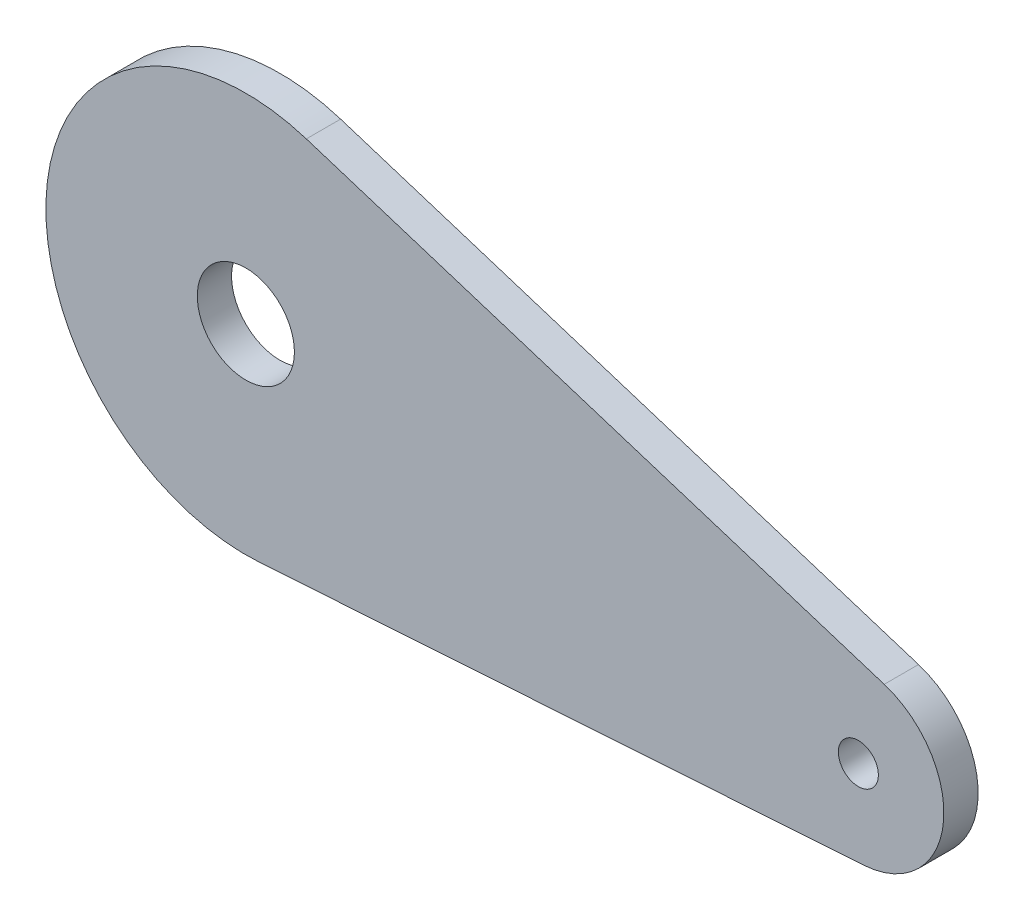
ISO-10303-21;
HEADER;
FILE_DESCRIPTION(('STEP AP214'),'2;1');
FILE_NAME('part.step','',(''),(''),'','','');
FILE_SCHEMA(('AUTOMOTIVE_DESIGN { 1 0 10303 214 1 1 1 1 }'));
ENDSEC;
DATA;
#1=APPLICATION_CONTEXT('core data for automotive mechanical design processes');
#2=APPLICATION_PROTOCOL_DEFINITION('international standard','automotive_design',2000,#1);
#3=PRODUCT_CONTEXT('',#1,'mechanical');
#4=PRODUCT('Part','Part','',(#3));
#5=PRODUCT_RELATED_PRODUCT_CATEGORY('part','',(#4));
#6=PRODUCT_DEFINITION_FORMATION('','',#4);
#7=PRODUCT_DEFINITION_CONTEXT('part definition',#1,'design');
#8=PRODUCT_DEFINITION('design','',#6,#7);
#9=PRODUCT_DEFINITION_SHAPE('','',#8);
#10=(LENGTH_UNIT() NAMED_UNIT(*) SI_UNIT(.MILLI.,.METRE.));
#11=(NAMED_UNIT(*) PLANE_ANGLE_UNIT() SI_UNIT($,.RADIAN.));
#12=(NAMED_UNIT(*) SI_UNIT($,.STERADIAN.) SOLID_ANGLE_UNIT());
#13=UNCERTAINTY_MEASURE_WITH_UNIT(LENGTH_MEASURE(1.E-05),#10,'distance_accuracy_value','');
#14=(GEOMETRIC_REPRESENTATION_CONTEXT(3) GLOBAL_UNCERTAINTY_ASSIGNED_CONTEXT((#13)) GLOBAL_UNIT_ASSIGNED_CONTEXT((#10,
#11,#12)) REPRESENTATION_CONTEXT('',''));
#15=CARTESIAN_POINT('',(0.,0.,0.));
#16=DIRECTION('',(0.,0.,1.));
#17=DIRECTION('',(1.,0.,0.));
#18=AXIS2_PLACEMENT_3D('',#15,#16,#17);
#19=CARTESIAN_POINT('',(-20.2200000000001,57.58,-3.));
#20=DIRECTION('',(0.,0.,1.));
#21=DIRECTION('',(1.,0.,0.));
#22=AXIS2_PLACEMENT_3D('',#19,#20,#21);
#23=CYLINDRICAL_SURFACE('',#22,17.5);
#24=CARTESIAN_POINT('',(-20.2200000000001,57.58,0.));
#25=DIRECTION('',(0.,0.,1.));
#26=DIRECTION('',(1.,0.,0.));
#27=AXIS2_PLACEMENT_3D('',#24,#25,#26);
#28=CIRCLE('',#27,17.5);
#29=CARTESIAN_POINT('',(-14.9261458080111,74.2600811686863,0.));
#30=VERTEX_POINT('',#29);
#31=CARTESIAN_POINT('',(-19.0697627154022,40.1178422241374,0.));
#32=VERTEX_POINT('',#31);
#33=EDGE_CURVE('E98',#30,#32,#28,.T.);
#34=ORIENTED_EDGE('',*,*,#33,.F.);
#35=DIRECTION('',(0.,0.,1.));
#36=VECTOR('',#35,1.);
#37=CARTESIAN_POINT('',(-14.9261458080111,74.2600811686863,-3.));
#38=LINE('',#37,#36);
#39=CARTESIAN_POINT('',(-14.9261458080111,74.2600811686863,-3.));
#40=VERTEX_POINT('',#39);
#41=EDGE_CURVE('E11',#40,#30,#38,.T.);
#42=ORIENTED_EDGE('',*,*,#41,.F.);
#43=CARTESIAN_POINT('',(-20.2200000000001,57.58,-3.));
#44=DIRECTION('',(0.,0.,1.));
#45=DIRECTION('',(1.,0.,0.));
#46=AXIS2_PLACEMENT_3D('',#43,#44,#45);
#47=CIRCLE('',#46,17.5);
#48=CARTESIAN_POINT('',(-19.0697627154022,40.1178422241374,-3.));
#49=VERTEX_POINT('',#48);
#50=EDGE_CURVE('E91',#40,#49,#47,.T.);
#51=ORIENTED_EDGE('',*,*,#50,.T.);
#52=DIRECTION('',(0.,0.,1.));
#53=VECTOR('',#52,1.);
#54=CARTESIAN_POINT('',(-19.0697627154022,40.1178422241374,-3.));
#55=LINE('',#54,#53);
#56=EDGE_CURVE('E36',#49,#32,#55,.T.);
#57=ORIENTED_EDGE('',*,*,#56,.T.);
#58=EDGE_LOOP('',(#34,#42,#51,#57));
#59=FACE_BOUND('',#58,.T.);
#60=ADVANCED_FACE('F33',(#59),#23,.T.);
#61=CARTESIAN_POINT('',(-14.9261458080111,74.2600811686863,-3.));
#62=DIRECTION('',(0.302505953827937,0.9531474953535,0.));
#63=DIRECTION('',(-0.9531474953535,0.302505953827937,0.));
#64=AXIS2_PLACEMENT_3D('',#61,#62,#63);
#65=PLANE('',#64);
#66=DIRECTION('',(-0.9531474953535,0.302505953827937,0.));
#67=VECTOR('',#66,1.);
#68=CARTESIAN_POINT('',(-14.9261458080111,74.2600811686863,0.));
#69=LINE('',#68,#67);
#70=CARTESIAN_POINT('',(35.6508319134873,58.2081721389071,0.));
#71=VERTEX_POINT('',#70);
#72=EDGE_CURVE('E93',#71,#30,#69,.T.);
#73=ORIENTED_EDGE('',*,*,#72,.F.);
#74=DIRECTION('',(0.,0.,1.));
#75=VECTOR('',#74,1.);
#76=CARTESIAN_POINT('',(35.6508319134873,58.2081721389071,-3.));
#77=LINE('',#76,#75);
#78=CARTESIAN_POINT('',(35.6508319134873,58.2081721389071,-3.));
#79=VERTEX_POINT('',#78);
#80=EDGE_CURVE('E42',#79,#71,#77,.T.);
#81=ORIENTED_EDGE('',*,*,#80,.F.);
#82=DIRECTION('',(-0.9531474953535,0.302505953827937,0.));
#83=VECTOR('',#82,1.);
#84=CARTESIAN_POINT('',(-14.9261458080111,74.2600811686863,-3.));
#85=LINE('',#84,#83);
#86=EDGE_CURVE('E88',#79,#40,#85,.T.);
#87=ORIENTED_EDGE('',*,*,#86,.T.);
#88=ORIENTED_EDGE('',*,*,#41,.T.);
#89=EDGE_LOOP('',(#73,#81,#87,#88));
#90=FACE_BOUND('',#89,.T.);
#91=ADVANCED_FACE('F109',(#90),#65,.T.);
#92=CARTESIAN_POINT('',(33.3866551345627,51.0741161027836,-3.));
#93=DIRECTION('',(0.,0.,1.));
#94=DIRECTION('',(1.,0.,0.));
#95=AXIS2_PLACEMENT_3D('',#92,#93,#94);
#96=CYLINDRICAL_SURFACE('',#95,7.48473459868629);
#97=CARTESIAN_POINT('',(33.3866551345627,51.0741161027836,0.));
#98=DIRECTION('',(0.,0.,1.));
#99=DIRECTION('',(-1.,0.,0.));
#100=AXIS2_PLACEMENT_3D('',#97,#98,#99);
#101=CIRCLE('',#100,7.48473459868629);
#102=CARTESIAN_POINT('',(33.8786106088901,43.6055665900569,0.));
#103=VERTEX_POINT('',#102);
#104=EDGE_CURVE('E83',#103,#71,#101,.T.);
#105=ORIENTED_EDGE('',*,*,#104,.F.);
#106=DIRECTION('',(0.,0.,1.));
#107=VECTOR('',#106,1.);
#108=CARTESIAN_POINT('',(33.8786106088901,43.6055665900569,-3.));
#109=LINE('',#108,#107);
#110=CARTESIAN_POINT('',(33.8786106088901,43.6055665900569,-3.));
#111=VERTEX_POINT('',#110);
#112=EDGE_CURVE('E78',#111,#103,#109,.T.);
#113=ORIENTED_EDGE('',*,*,#112,.F.);
#114=CARTESIAN_POINT('',(33.3866551345627,51.0741161027836,-3.));
#115=DIRECTION('',(0.,0.,1.));
#116=DIRECTION('',(-1.,0.,0.));
#117=AXIS2_PLACEMENT_3D('',#114,#115,#116);
#118=CIRCLE('',#117,7.48473459868629);
#119=EDGE_CURVE('E81',#111,#79,#118,.T.);
#120=ORIENTED_EDGE('',*,*,#119,.T.);
#121=ORIENTED_EDGE('',*,*,#80,.T.);
#122=EDGE_LOOP('',(#105,#113,#120,#121));
#123=FACE_BOUND('',#122,.T.);
#124=ADVANCED_FACE('F80',(#123),#96,.T.);
#125=CARTESIAN_POINT('',(-19.0697627154022,40.1178422241374,-3.));
#126=DIRECTION('',(0.0657278448341626,-0.997837587192152,0.));
#127=DIRECTION('',(0.997837587192153,0.0657278448341626,0.));
#128=AXIS2_PLACEMENT_3D('',#125,#126,#127);
#129=PLANE('',#128);
#130=DIRECTION('',(0.997837587192153,0.0657278448341626,0.));
#131=VECTOR('',#130,1.);
#132=CARTESIAN_POINT('',(-19.0697627154022,40.1178422241374,0.));
#133=LINE('',#132,#131);
#134=EDGE_CURVE('E101',#32,#103,#133,.T.);
#135=ORIENTED_EDGE('',*,*,#134,.F.);
#136=ORIENTED_EDGE('',*,*,#56,.F.);
#137=DIRECTION('',(0.997837587192153,0.0657278448341626,0.));
#138=VECTOR('',#137,1.);
#139=CARTESIAN_POINT('',(-19.0697627154022,40.1178422241374,-3.));
#140=LINE('',#139,#138);
#141=EDGE_CURVE('E87',#49,#111,#140,.T.);
#142=ORIENTED_EDGE('',*,*,#141,.T.);
#143=ORIENTED_EDGE('',*,*,#112,.T.);
#144=EDGE_LOOP('',(#135,#136,#142,#143));
#145=FACE_BOUND('',#144,.T.);
#146=ADVANCED_FACE('F90',(#145),#129,.T.);
#147=CARTESIAN_POINT('',(-20.2200000000001,57.58,-3.));
#148=DIRECTION('',(0.,0.,1.));
#149=DIRECTION('',(1.,0.,0.));
#150=AXIS2_PLACEMENT_3D('',#147,#148,#149);
#151=PLANE('',#150);
#152=CARTESIAN_POINT('',(-20.2200000000001,57.58,-3.));
#153=DIRECTION('',(0.,0.,1.));
#154=DIRECTION('',(1.,0.,0.));
#155=AXIS2_PLACEMENT_3D('',#152,#153,#154);
#156=CIRCLE('',#155,4.25);
#157=CARTESIAN_POINT('',(-15.9700000000001,57.58,-3.));
#158=VERTEX_POINT('',#157);
#159=EDGE_CURVE('E142',#158,#158,#156,.T.);
#160=ORIENTED_EDGE('',*,*,#159,.T.);
#161=EDGE_LOOP('',(#160));
#162=FACE_BOUND('',#161,.T.);
#163=CARTESIAN_POINT('',(33.3866551345627,51.0741161027836,-3.));
#164=DIRECTION('',(0.,0.,1.));
#165=DIRECTION('',(1.,0.,0.));
#166=AXIS2_PLACEMENT_3D('',#163,#164,#165);
#167=CIRCLE('',#166,1.75);
#168=CARTESIAN_POINT('',(35.1366551345627,51.0741161027836,-3.));
#169=VERTEX_POINT('',#168);
#170=EDGE_CURVE('E102',#169,#169,#167,.T.);
#171=ORIENTED_EDGE('',*,*,#170,.T.);
#172=EDGE_LOOP('',(#171));
#173=FACE_BOUND('',#172,.T.);
#174=ORIENTED_EDGE('',*,*,#50,.F.);
#175=ORIENTED_EDGE('',*,*,#86,.F.);
#176=ORIENTED_EDGE('',*,*,#119,.F.);
#177=ORIENTED_EDGE('',*,*,#141,.F.);
#178=EDGE_LOOP('',(#174,#175,#176,#177));
#179=FACE_BOUND('',#178,.T.);
#180=ADVANCED_FACE('F86',(#162,#173,#179),#151,.F.);
#181=CARTESIAN_POINT('',(-20.2200000000001,57.58,0.));
#182=DIRECTION('',(0.,0.,1.));
#183=DIRECTION('',(1.,0.,0.));
#184=AXIS2_PLACEMENT_3D('',#181,#182,#183);
#185=PLANE('',#184);
#186=CARTESIAN_POINT('',(-20.2200000000001,57.58,0.));
#187=DIRECTION('',(0.,0.,1.));
#188=DIRECTION('',(1.,0.,0.));
#189=AXIS2_PLACEMENT_3D('',#186,#187,#188);
#190=CIRCLE('',#189,4.25);
#191=CARTESIAN_POINT('',(-15.9700000000001,57.58,0.));
#192=VERTEX_POINT('',#191);
#193=EDGE_CURVE('E145',#192,#192,#190,.T.);
#194=ORIENTED_EDGE('',*,*,#193,.F.);
#195=EDGE_LOOP('',(#194));
#196=FACE_BOUND('',#195,.T.);
#197=CARTESIAN_POINT('',(33.3866551345627,51.0741161027836,0.));
#198=DIRECTION('',(0.,0.,1.));
#199=DIRECTION('',(1.,0.,0.));
#200=AXIS2_PLACEMENT_3D('',#197,#198,#199);
#201=CIRCLE('',#200,1.75);
#202=CARTESIAN_POINT('',(35.1366551345627,51.0741161027836,0.));
#203=VERTEX_POINT('',#202);
#204=EDGE_CURVE('E147',#203,#203,#201,.T.);
#205=ORIENTED_EDGE('',*,*,#204,.F.);
#206=EDGE_LOOP('',(#205));
#207=FACE_BOUND('',#206,.T.);
#208=ORIENTED_EDGE('',*,*,#33,.T.);
#209=ORIENTED_EDGE('',*,*,#134,.T.);
#210=ORIENTED_EDGE('',*,*,#104,.T.);
#211=ORIENTED_EDGE('',*,*,#72,.T.);
#212=EDGE_LOOP('',(#208,#209,#210,#211));
#213=FACE_BOUND('',#212,.T.);
#214=ADVANCED_FACE('F108',(#196,#207,#213),#185,.T.);
#215=CARTESIAN_POINT('',(33.3866551345627,51.0741161027836,-3.));
#216=DIRECTION('',(0.,0.,1.));
#217=DIRECTION('',(1.,0.,0.));
#218=AXIS2_PLACEMENT_3D('',#215,#216,#217);
#219=CYLINDRICAL_SURFACE('',#218,1.75);
#220=ORIENTED_EDGE('',*,*,#170,.F.);
#221=EDGE_LOOP('',(#220));
#222=FACE_BOUND('',#221,.T.);
#223=ORIENTED_EDGE('',*,*,#204,.T.);
#224=EDGE_LOOP('',(#223));
#225=FACE_BOUND('',#224,.T.);
#226=ADVANCED_FACE('F127',(#222,#225),#219,.F.);
#227=CARTESIAN_POINT('',(-20.2200000000001,57.58,-3.));
#228=DIRECTION('',(0.,0.,1.));
#229=DIRECTION('',(1.,0.,0.));
#230=AXIS2_PLACEMENT_3D('',#227,#228,#229);
#231=CYLINDRICAL_SURFACE('',#230,4.25);
#232=ORIENTED_EDGE('',*,*,#159,.F.);
#233=EDGE_LOOP('',(#232));
#234=FACE_BOUND('',#233,.T.);
#235=ORIENTED_EDGE('',*,*,#193,.T.);
#236=EDGE_LOOP('',(#235));
#237=FACE_BOUND('',#236,.T.);
#238=ADVANCED_FACE('F134',(#234,#237),#231,.F.);
#239=CLOSED_SHELL('',(#60,#91,#124,#146,#180,#214,#226,#238));
#240=MANIFOLD_SOLID_BREP('B2',#239);
#241=ADVANCED_BREP_SHAPE_REPRESENTATION('',(#18,#240),#14);
#242=SHAPE_DEFINITION_REPRESENTATION(#9,#241);
ENDSEC;
END-ISO-10303-21;
